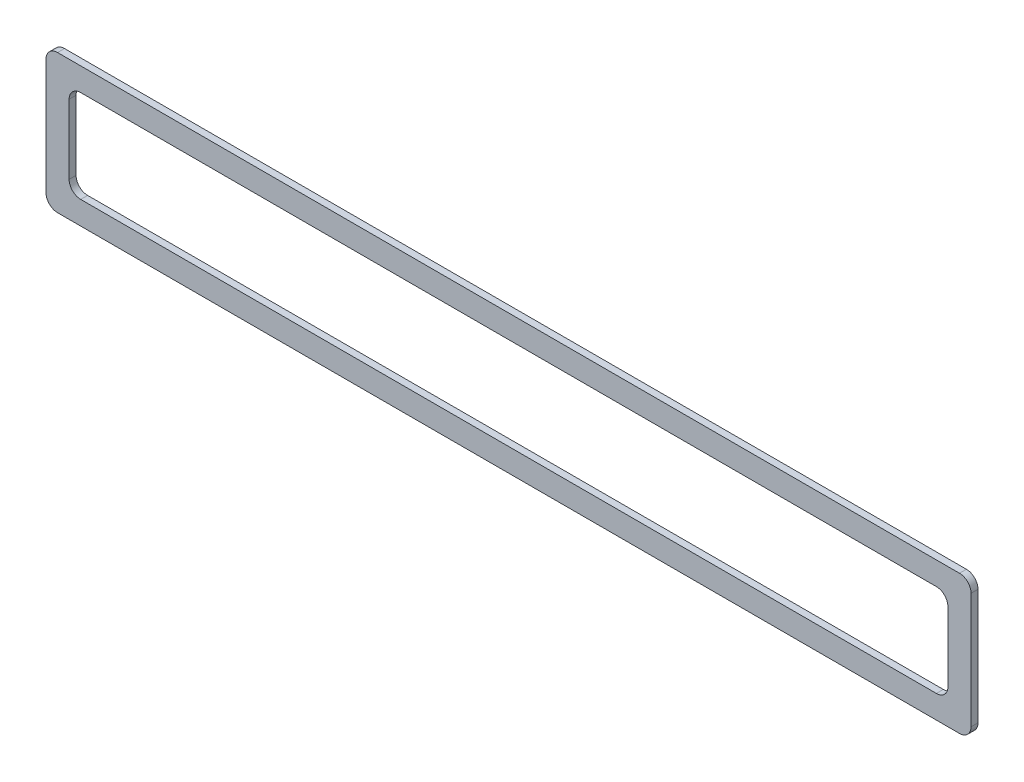
ISO-10303-21;
HEADER;
FILE_DESCRIPTION(('STEP AP214'),'2;1');
FILE_NAME('part.step','',(''),(''),'','','');
FILE_SCHEMA(('AUTOMOTIVE_DESIGN { 1 0 10303 214 1 1 1 1 }'));
ENDSEC;
DATA;
#1=APPLICATION_CONTEXT('core data for automotive mechanical design processes');
#2=APPLICATION_PROTOCOL_DEFINITION('international standard','automotive_design',2000,#1);
#3=PRODUCT_CONTEXT('',#1,'mechanical');
#4=PRODUCT('Part','Part','',(#3));
#5=PRODUCT_RELATED_PRODUCT_CATEGORY('part','',(#4));
#6=PRODUCT_DEFINITION_FORMATION('','',#4);
#7=PRODUCT_DEFINITION_CONTEXT('part definition',#1,'design');
#8=PRODUCT_DEFINITION('design','',#6,#7);
#9=PRODUCT_DEFINITION_SHAPE('','',#8);
#10=(LENGTH_UNIT() NAMED_UNIT(*) SI_UNIT(.MILLI.,.METRE.));
#11=(NAMED_UNIT(*) PLANE_ANGLE_UNIT() SI_UNIT($,.RADIAN.));
#12=(NAMED_UNIT(*) SI_UNIT($,.STERADIAN.) SOLID_ANGLE_UNIT());
#13=UNCERTAINTY_MEASURE_WITH_UNIT(LENGTH_MEASURE(1.E-05),#10,'distance_accuracy_value','');
#14=(GEOMETRIC_REPRESENTATION_CONTEXT(3) GLOBAL_UNCERTAINTY_ASSIGNED_CONTEXT((#13)) GLOBAL_UNIT_ASSIGNED_CONTEXT((#10,
#11,#12)) REPRESENTATION_CONTEXT('',''));
#15=CARTESIAN_POINT('',(0.,0.,0.));
#16=DIRECTION('',(0.,0.,1.));
#17=DIRECTION('',(1.,0.,0.));
#18=AXIS2_PLACEMENT_3D('',#15,#16,#17);
#19=CARTESIAN_POINT('',(195.,25.,3.));
#20=DIRECTION('',(0.,0.,-1.));
#21=DIRECTION('',(-1.,0.,0.));
#22=AXIS2_PLACEMENT_3D('',#19,#20,#21);
#23=PLANE('',#22);
#24=CARTESIAN_POINT('',(195.,25.,3.));
#25=DIRECTION('',(0.,0.,1.));
#26=DIRECTION('',(-1.,0.,0.));
#27=AXIS2_PLACEMENT_3D('',#24,#25,#26);
#28=CIRCLE('',#27,5.);
#29=CARTESIAN_POINT('',(200.,25.,3.));
#30=VERTEX_POINT('',#29);
#31=CARTESIAN_POINT('',(195.,30.,3.));
#32=VERTEX_POINT('',#31);
#33=EDGE_CURVE('E209',#30,#32,#28,.T.);
#34=ORIENTED_EDGE('',*,*,#33,.T.);
#35=DIRECTION('',(-1.,0.,0.));
#36=VECTOR('',#35,1.);
#37=CARTESIAN_POINT('',(-195.,30.,3.));
#38=LINE('',#37,#36);
#39=CARTESIAN_POINT('',(-195.,30.,3.));
#40=VERTEX_POINT('',#39);
#41=EDGE_CURVE('E212',#32,#40,#38,.T.);
#42=ORIENTED_EDGE('',*,*,#41,.T.);
#43=CARTESIAN_POINT('',(-195.,25.,3.));
#44=DIRECTION('',(0.,0.,1.));
#45=DIRECTION('',(-1.,0.,0.));
#46=AXIS2_PLACEMENT_3D('',#43,#44,#45);
#47=CIRCLE('',#46,5.);
#48=CARTESIAN_POINT('',(-200.,25.,3.));
#49=VERTEX_POINT('',#48);
#50=EDGE_CURVE('E215',#40,#49,#47,.T.);
#51=ORIENTED_EDGE('',*,*,#50,.T.);
#52=DIRECTION('',(0.,-1.,0.));
#53=VECTOR('',#52,1.);
#54=CARTESIAN_POINT('',(-200.,-25.,3.));
#55=LINE('',#54,#53);
#56=CARTESIAN_POINT('',(-200.,-25.,3.));
#57=VERTEX_POINT('',#56);
#58=EDGE_CURVE('E217',#49,#57,#55,.T.);
#59=ORIENTED_EDGE('',*,*,#58,.T.);
#60=CARTESIAN_POINT('',(-195.,-25.,3.));
#61=DIRECTION('',(0.,0.,1.));
#62=DIRECTION('',(-1.,0.,0.));
#63=AXIS2_PLACEMENT_3D('',#60,#61,#62);
#64=CIRCLE('',#63,5.);
#65=CARTESIAN_POINT('',(-195.,-30.,3.));
#66=VERTEX_POINT('',#65);
#67=EDGE_CURVE('E219',#57,#66,#64,.T.);
#68=ORIENTED_EDGE('',*,*,#67,.T.);
#69=DIRECTION('',(1.,0.,0.));
#70=VECTOR('',#69,1.);
#71=CARTESIAN_POINT('',(-195.,-30.,3.));
#72=LINE('',#71,#70);
#73=CARTESIAN_POINT('',(195.,-30.,3.));
#74=VERTEX_POINT('',#73);
#75=EDGE_CURVE('E221',#66,#74,#72,.T.);
#76=ORIENTED_EDGE('',*,*,#75,.T.);
#77=CARTESIAN_POINT('',(195.,-25.,3.));
#78=DIRECTION('',(0.,0.,1.));
#79=DIRECTION('',(1.,0.,0.));
#80=AXIS2_PLACEMENT_3D('',#77,#78,#79);
#81=CIRCLE('',#80,5.);
#82=CARTESIAN_POINT('',(200.,-25.,3.));
#83=VERTEX_POINT('',#82);
#84=EDGE_CURVE('E223',#74,#83,#81,.T.);
#85=ORIENTED_EDGE('',*,*,#84,.T.);
#86=DIRECTION('',(0.,1.,0.));
#87=VECTOR('',#86,1.);
#88=CARTESIAN_POINT('',(200.,-25.,3.));
#89=LINE('',#88,#87);
#90=EDGE_CURVE('E225',#83,#30,#89,.T.);
#91=ORIENTED_EDGE('',*,*,#90,.T.);
#92=EDGE_LOOP('',(#34,#42,#51,#59,#68,#76,#85,#91));
#93=FACE_BOUND('',#92,.T.);
#94=CARTESIAN_POINT('',(-185.,15.,3.));
#95=DIRECTION('',(0.,0.,1.));
#96=DIRECTION('',(-1.,0.,0.));
#97=AXIS2_PLACEMENT_3D('',#94,#95,#96);
#98=CIRCLE('',#97,5.);
#99=CARTESIAN_POINT('',(-185.,20.,3.));
#100=VERTEX_POINT('',#99);
#101=CARTESIAN_POINT('',(-190.,15.,3.));
#102=VERTEX_POINT('',#101);
#103=EDGE_CURVE('E144',#100,#102,#98,.T.);
#104=ORIENTED_EDGE('',*,*,#103,.F.);
#105=DIRECTION('',(-1.,0.,0.));
#106=VECTOR('',#105,1.);
#107=CARTESIAN_POINT('',(-185.,20.,3.));
#108=LINE('',#107,#106);
#109=CARTESIAN_POINT('',(185.,20.,3.));
#110=VERTEX_POINT('',#109);
#111=EDGE_CURVE('E177',#110,#100,#108,.T.);
#112=ORIENTED_EDGE('',*,*,#111,.F.);
#113=CARTESIAN_POINT('',(185.,15.,3.));
#114=DIRECTION('',(0.,0.,1.));
#115=DIRECTION('',(-1.,0.,0.));
#116=AXIS2_PLACEMENT_3D('',#113,#114,#115);
#117=CIRCLE('',#116,5.);
#118=CARTESIAN_POINT('',(190.,15.,3.));
#119=VERTEX_POINT('',#118);
#120=EDGE_CURVE('E175',#119,#110,#117,.T.);
#121=ORIENTED_EDGE('',*,*,#120,.F.);
#122=DIRECTION('',(0.,1.,0.));
#123=VECTOR('',#122,1.);
#124=CARTESIAN_POINT('',(190.,-15.,3.));
#125=LINE('',#124,#123);
#126=CARTESIAN_POINT('',(190.,-15.,3.));
#127=VERTEX_POINT('',#126);
#128=EDGE_CURVE('E173',#127,#119,#125,.T.);
#129=ORIENTED_EDGE('',*,*,#128,.F.);
#130=CARTESIAN_POINT('',(185.,-15.,3.));
#131=DIRECTION('',(0.,0.,1.));
#132=DIRECTION('',(1.,0.,0.));
#133=AXIS2_PLACEMENT_3D('',#130,#131,#132);
#134=CIRCLE('',#133,5.);
#135=CARTESIAN_POINT('',(185.,-20.,3.));
#136=VERTEX_POINT('',#135);
#137=EDGE_CURVE('E171',#136,#127,#134,.T.);
#138=ORIENTED_EDGE('',*,*,#137,.F.);
#139=DIRECTION('',(1.,0.,0.));
#140=VECTOR('',#139,1.);
#141=CARTESIAN_POINT('',(-185.,-20.,3.));
#142=LINE('',#141,#140);
#143=CARTESIAN_POINT('',(-185.,-20.,3.));
#144=VERTEX_POINT('',#143);
#145=EDGE_CURVE('E167',#144,#136,#142,.T.);
#146=ORIENTED_EDGE('',*,*,#145,.F.);
#147=CARTESIAN_POINT('',(-185.,-15.,3.));
#148=DIRECTION('',(0.,0.,1.));
#149=DIRECTION('',(-1.,0.,0.));
#150=AXIS2_PLACEMENT_3D('',#147,#148,#149);
#151=CIRCLE('',#150,5.);
#152=CARTESIAN_POINT('',(-190.,-15.,3.));
#153=VERTEX_POINT('',#152);
#154=EDGE_CURVE('E165',#153,#144,#151,.T.);
#155=ORIENTED_EDGE('',*,*,#154,.F.);
#156=DIRECTION('',(0.,-1.,0.));
#157=VECTOR('',#156,1.);
#158=CARTESIAN_POINT('',(-190.,-15.,3.));
#159=LINE('',#158,#157);
#160=EDGE_CURVE('E152',#102,#153,#159,.T.);
#161=ORIENTED_EDGE('',*,*,#160,.F.);
#162=EDGE_LOOP('',(#104,#112,#121,#129,#138,#146,#155,#161));
#163=FACE_BOUND('',#162,.T.);
#164=ADVANCED_FACE('F31',(#93,#163),#23,.F.);
#165=CARTESIAN_POINT('',(195.,25.,0.));
#166=DIRECTION('',(0.,0.,-1.));
#167=DIRECTION('',(-1.,0.,0.));
#168=AXIS2_PLACEMENT_3D('',#165,#166,#167);
#169=PLANE('',#168);
#170=CARTESIAN_POINT('',(195.,25.,0.));
#171=DIRECTION('',(0.,0.,1.));
#172=DIRECTION('',(-1.,0.,0.));
#173=AXIS2_PLACEMENT_3D('',#170,#171,#172);
#174=CIRCLE('',#173,5.);
#175=CARTESIAN_POINT('',(200.,25.,0.));
#176=VERTEX_POINT('',#175);
#177=CARTESIAN_POINT('',(195.,30.,0.));
#178=VERTEX_POINT('',#177);
#179=EDGE_CURVE('E160',#176,#178,#174,.T.);
#180=ORIENTED_EDGE('',*,*,#179,.F.);
#181=DIRECTION('',(0.,1.,0.));
#182=VECTOR('',#181,1.);
#183=CARTESIAN_POINT('',(200.,-25.,0.));
#184=LINE('',#183,#182);
#185=CARTESIAN_POINT('',(200.,-25.,0.));
#186=VERTEX_POINT('',#185);
#187=EDGE_CURVE('E213',#186,#176,#184,.T.);
#188=ORIENTED_EDGE('',*,*,#187,.F.);
#189=CARTESIAN_POINT('',(195.,-25.,0.));
#190=DIRECTION('',(0.,0.,1.));
#191=DIRECTION('',(1.,0.,0.));
#192=AXIS2_PLACEMENT_3D('',#189,#190,#191);
#193=CIRCLE('',#192,5.);
#194=CARTESIAN_POINT('',(195.,-30.,0.));
#195=VERTEX_POINT('',#194);
#196=EDGE_CURVE('E240',#195,#186,#193,.T.);
#197=ORIENTED_EDGE('',*,*,#196,.F.);
#198=DIRECTION('',(1.,0.,0.));
#199=VECTOR('',#198,1.);
#200=CARTESIAN_POINT('',(-195.,-30.,0.));
#201=LINE('',#200,#199);
#202=CARTESIAN_POINT('',(-195.,-30.,0.));
#203=VERTEX_POINT('',#202);
#204=EDGE_CURVE('E238',#203,#195,#201,.T.);
#205=ORIENTED_EDGE('',*,*,#204,.F.);
#206=CARTESIAN_POINT('',(-195.,-25.,0.));
#207=DIRECTION('',(0.,0.,1.));
#208=DIRECTION('',(-1.,0.,0.));
#209=AXIS2_PLACEMENT_3D('',#206,#207,#208);
#210=CIRCLE('',#209,5.);
#211=CARTESIAN_POINT('',(-200.,-25.,0.));
#212=VERTEX_POINT('',#211);
#213=EDGE_CURVE('E236',#212,#203,#210,.T.);
#214=ORIENTED_EDGE('',*,*,#213,.F.);
#215=DIRECTION('',(0.,-1.,0.));
#216=VECTOR('',#215,1.);
#217=CARTESIAN_POINT('',(-200.,-25.,0.));
#218=LINE('',#217,#216);
#219=CARTESIAN_POINT('',(-200.,25.,0.));
#220=VERTEX_POINT('',#219);
#221=EDGE_CURVE('E234',#220,#212,#218,.T.);
#222=ORIENTED_EDGE('',*,*,#221,.F.);
#223=CARTESIAN_POINT('',(-195.,25.,0.));
#224=DIRECTION('',(0.,0.,1.));
#225=DIRECTION('',(-1.,0.,0.));
#226=AXIS2_PLACEMENT_3D('',#223,#224,#225);
#227=CIRCLE('',#226,5.);
#228=CARTESIAN_POINT('',(-195.,30.,0.));
#229=VERTEX_POINT('',#228);
#230=EDGE_CURVE('E232',#229,#220,#227,.T.);
#231=ORIENTED_EDGE('',*,*,#230,.F.);
#232=DIRECTION('',(-1.,0.,0.));
#233=VECTOR('',#232,1.);
#234=CARTESIAN_POINT('',(-195.,30.,0.));
#235=LINE('',#234,#233);
#236=EDGE_CURVE('E230',#178,#229,#235,.T.);
#237=ORIENTED_EDGE('',*,*,#236,.F.);
#238=EDGE_LOOP('',(#180,#188,#197,#205,#214,#222,#231,#237));
#239=FACE_BOUND('',#238,.T.);
#240=DIRECTION('',(-1.,0.,0.));
#241=VECTOR('',#240,1.);
#242=CARTESIAN_POINT('',(-185.,20.,0.));
#243=LINE('',#242,#241);
#244=CARTESIAN_POINT('',(185.,20.,0.));
#245=VERTEX_POINT('',#244);
#246=CARTESIAN_POINT('',(-185.,20.,0.));
#247=VERTEX_POINT('',#246);
#248=EDGE_CURVE('E153',#245,#247,#243,.T.);
#249=ORIENTED_EDGE('',*,*,#248,.T.);
#250=CARTESIAN_POINT('',(-185.,15.,0.));
#251=DIRECTION('',(0.,0.,1.));
#252=DIRECTION('',(-1.,0.,0.));
#253=AXIS2_PLACEMENT_3D('',#250,#251,#252);
#254=CIRCLE('',#253,5.);
#255=CARTESIAN_POINT('',(-190.,15.,0.));
#256=VERTEX_POINT('',#255);
#257=EDGE_CURVE('E54',#247,#256,#254,.T.);
#258=ORIENTED_EDGE('',*,*,#257,.T.);
#259=DIRECTION('',(0.,-1.,0.));
#260=VECTOR('',#259,1.);
#261=CARTESIAN_POINT('',(-190.,-15.,0.));
#262=LINE('',#261,#260);
#263=CARTESIAN_POINT('',(-190.,-15.,0.));
#264=VERTEX_POINT('',#263);
#265=EDGE_CURVE('E159',#256,#264,#262,.T.);
#266=ORIENTED_EDGE('',*,*,#265,.T.);
#267=CARTESIAN_POINT('',(-185.,-15.,0.));
#268=DIRECTION('',(0.,0.,1.));
#269=DIRECTION('',(-1.,0.,0.));
#270=AXIS2_PLACEMENT_3D('',#267,#268,#269);
#271=CIRCLE('',#270,5.);
#272=CARTESIAN_POINT('',(-185.,-20.,0.));
#273=VERTEX_POINT('',#272);
#274=EDGE_CURVE('E181',#264,#273,#271,.T.);
#275=ORIENTED_EDGE('',*,*,#274,.T.);
#276=DIRECTION('',(1.,0.,0.));
#277=VECTOR('',#276,1.);
#278=CARTESIAN_POINT('',(-185.,-20.,0.));
#279=LINE('',#278,#277);
#280=CARTESIAN_POINT('',(185.,-20.,0.));
#281=VERTEX_POINT('',#280);
#282=EDGE_CURVE('E184',#273,#281,#279,.T.);
#283=ORIENTED_EDGE('',*,*,#282,.T.);
#284=CARTESIAN_POINT('',(185.,-15.,0.));
#285=DIRECTION('',(0.,0.,1.));
#286=DIRECTION('',(1.,0.,0.));
#287=AXIS2_PLACEMENT_3D('',#284,#285,#286);
#288=CIRCLE('',#287,5.);
#289=CARTESIAN_POINT('',(190.,-15.,0.));
#290=VERTEX_POINT('',#289);
#291=EDGE_CURVE('E187',#281,#290,#288,.T.);
#292=ORIENTED_EDGE('',*,*,#291,.T.);
#293=DIRECTION('',(0.,1.,0.));
#294=VECTOR('',#293,1.);
#295=CARTESIAN_POINT('',(190.,-15.,0.));
#296=LINE('',#295,#294);
#297=CARTESIAN_POINT('',(190.,15.,0.));
#298=VERTEX_POINT('',#297);
#299=EDGE_CURVE('E190',#290,#298,#296,.T.);
#300=ORIENTED_EDGE('',*,*,#299,.T.);
#301=CARTESIAN_POINT('',(185.,15.,0.));
#302=DIRECTION('',(0.,0.,1.));
#303=DIRECTION('',(-1.,0.,0.));
#304=AXIS2_PLACEMENT_3D('',#301,#302,#303);
#305=CIRCLE('',#304,5.);
#306=EDGE_CURVE('E193',#298,#245,#305,.T.);
#307=ORIENTED_EDGE('',*,*,#306,.T.);
#308=EDGE_LOOP('',(#249,#258,#266,#275,#283,#292,#300,#307));
#309=FACE_BOUND('',#308,.T.);
#310=ADVANCED_FACE('F270',(#239,#309),#169,.T.);
#311=CARTESIAN_POINT('',(195.,25.,3.));
#312=DIRECTION('',(0.,0.,-1.));
#313=DIRECTION('',(-1.,0.,0.));
#314=AXIS2_PLACEMENT_3D('',#311,#312,#313);
#315=CYLINDRICAL_SURFACE('',#314,5.);
#316=ORIENTED_EDGE('',*,*,#179,.T.);
#317=DIRECTION('',(0.,0.,-1.));
#318=VECTOR('',#317,1.);
#319=CARTESIAN_POINT('',(195.,30.,3.));
#320=LINE('',#319,#318);
#321=EDGE_CURVE('E11',#32,#178,#320,.T.);
#322=ORIENTED_EDGE('',*,*,#321,.F.);
#323=ORIENTED_EDGE('',*,*,#33,.F.);
#324=DIRECTION('',(0.,0.,-1.));
#325=VECTOR('',#324,1.);
#326=CARTESIAN_POINT('',(200.,25.,3.));
#327=LINE('',#326,#325);
#328=EDGE_CURVE('E227',#30,#176,#327,.T.);
#329=ORIENTED_EDGE('',*,*,#328,.T.);
#330=EDGE_LOOP('',(#316,#322,#323,#329));
#331=FACE_BOUND('',#330,.T.);
#332=ADVANCED_FACE('F33',(#331),#315,.T.);
#333=CARTESIAN_POINT('',(-195.,30.,3.));
#334=DIRECTION('',(0.,-1.,0.));
#335=DIRECTION('',(0.,0.,-1.));
#336=AXIS2_PLACEMENT_3D('',#333,#334,#335);
#337=PLANE('',#336);
#338=ORIENTED_EDGE('',*,*,#236,.T.);
#339=DIRECTION('',(0.,0.,-1.));
#340=VECTOR('',#339,1.);
#341=CARTESIAN_POINT('',(-195.,30.,3.));
#342=LINE('',#341,#340);
#343=EDGE_CURVE('E39',#40,#229,#342,.T.);
#344=ORIENTED_EDGE('',*,*,#343,.F.);
#345=ORIENTED_EDGE('',*,*,#41,.F.);
#346=ORIENTED_EDGE('',*,*,#321,.T.);
#347=EDGE_LOOP('',(#338,#344,#345,#346));
#348=FACE_BOUND('',#347,.T.);
#349=ADVANCED_FACE('F287',(#348),#337,.F.);
#350=CARTESIAN_POINT('',(-195.,25.,3.));
#351=DIRECTION('',(0.,0.,-1.));
#352=DIRECTION('',(-1.,0.,0.));
#353=AXIS2_PLACEMENT_3D('',#350,#351,#352);
#354=CYLINDRICAL_SURFACE('',#353,5.);
#355=ORIENTED_EDGE('',*,*,#230,.T.);
#356=DIRECTION('',(0.,0.,-1.));
#357=VECTOR('',#356,1.);
#358=CARTESIAN_POINT('',(-200.,25.,3.));
#359=LINE('',#358,#357);
#360=EDGE_CURVE('E257',#49,#220,#359,.T.);
#361=ORIENTED_EDGE('',*,*,#360,.F.);
#362=ORIENTED_EDGE('',*,*,#50,.F.);
#363=ORIENTED_EDGE('',*,*,#343,.T.);
#364=EDGE_LOOP('',(#355,#361,#362,#363));
#365=FACE_BOUND('',#364,.T.);
#366=ADVANCED_FACE('F264',(#365),#354,.T.);
#367=CARTESIAN_POINT('',(-200.,-25.,3.));
#368=DIRECTION('',(1.,0.,0.));
#369=DIRECTION('',(0.,0.,-1.));
#370=AXIS2_PLACEMENT_3D('',#367,#368,#369);
#371=PLANE('',#370);
#372=ORIENTED_EDGE('',*,*,#221,.T.);
#373=DIRECTION('',(0.,0.,-1.));
#374=VECTOR('',#373,1.);
#375=CARTESIAN_POINT('',(-200.,-25.,3.));
#376=LINE('',#375,#374);
#377=EDGE_CURVE('E254',#57,#212,#376,.T.);
#378=ORIENTED_EDGE('',*,*,#377,.F.);
#379=ORIENTED_EDGE('',*,*,#58,.F.);
#380=ORIENTED_EDGE('',*,*,#360,.T.);
#381=EDGE_LOOP('',(#372,#378,#379,#380));
#382=FACE_BOUND('',#381,.T.);
#383=ADVANCED_FACE('F276',(#382),#371,.F.);
#384=CARTESIAN_POINT('',(-195.,-25.,3.));
#385=DIRECTION('',(0.,0.,-1.));
#386=DIRECTION('',(-1.,0.,0.));
#387=AXIS2_PLACEMENT_3D('',#384,#385,#386);
#388=CYLINDRICAL_SURFACE('',#387,5.);
#389=ORIENTED_EDGE('',*,*,#213,.T.);
#390=DIRECTION('',(0.,0.,-1.));
#391=VECTOR('',#390,1.);
#392=CARTESIAN_POINT('',(-195.,-30.,3.));
#393=LINE('',#392,#391);
#394=EDGE_CURVE('E251',#66,#203,#393,.T.);
#395=ORIENTED_EDGE('',*,*,#394,.F.);
#396=ORIENTED_EDGE('',*,*,#67,.F.);
#397=ORIENTED_EDGE('',*,*,#377,.T.);
#398=EDGE_LOOP('',(#389,#395,#396,#397));
#399=FACE_BOUND('',#398,.T.);
#400=ADVANCED_FACE('F280',(#399),#388,.T.);
#401=CARTESIAN_POINT('',(-195.,-30.,3.));
#402=DIRECTION('',(0.,1.,0.));
#403=DIRECTION('',(0.,0.,1.));
#404=AXIS2_PLACEMENT_3D('',#401,#402,#403);
#405=PLANE('',#404);
#406=ORIENTED_EDGE('',*,*,#204,.T.);
#407=DIRECTION('',(0.,0.,-1.));
#408=VECTOR('',#407,1.);
#409=CARTESIAN_POINT('',(195.,-30.,3.));
#410=LINE('',#409,#408);
#411=EDGE_CURVE('E248',#74,#195,#410,.T.);
#412=ORIENTED_EDGE('',*,*,#411,.F.);
#413=ORIENTED_EDGE('',*,*,#75,.F.);
#414=ORIENTED_EDGE('',*,*,#394,.T.);
#415=EDGE_LOOP('',(#406,#412,#413,#414));
#416=FACE_BOUND('',#415,.T.);
#417=ADVANCED_FACE('F300',(#416),#405,.F.);
#418=CARTESIAN_POINT('',(195.,-25.,3.));
#419=DIRECTION('',(0.,0.,-1.));
#420=DIRECTION('',(-1.,0.,0.));
#421=AXIS2_PLACEMENT_3D('',#418,#419,#420);
#422=CYLINDRICAL_SURFACE('',#421,5.);
#423=ORIENTED_EDGE('',*,*,#196,.T.);
#424=DIRECTION('',(0.,0.,-1.));
#425=VECTOR('',#424,1.);
#426=CARTESIAN_POINT('',(200.,-25.,3.));
#427=LINE('',#426,#425);
#428=EDGE_CURVE('E245',#83,#186,#427,.T.);
#429=ORIENTED_EDGE('',*,*,#428,.F.);
#430=ORIENTED_EDGE('',*,*,#84,.F.);
#431=ORIENTED_EDGE('',*,*,#411,.T.);
#432=EDGE_LOOP('',(#423,#429,#430,#431));
#433=FACE_BOUND('',#432,.T.);
#434=ADVANCED_FACE('F298',(#433),#422,.T.);
#435=CARTESIAN_POINT('',(200.,-25.,3.));
#436=DIRECTION('',(-1.,0.,0.));
#437=DIRECTION('',(0.,0.,1.));
#438=AXIS2_PLACEMENT_3D('',#435,#436,#437);
#439=PLANE('',#438);
#440=ORIENTED_EDGE('',*,*,#187,.T.);
#441=ORIENTED_EDGE('',*,*,#328,.F.);
#442=ORIENTED_EDGE('',*,*,#90,.F.);
#443=ORIENTED_EDGE('',*,*,#428,.T.);
#444=EDGE_LOOP('',(#440,#441,#442,#443));
#445=FACE_BOUND('',#444,.T.);
#446=ADVANCED_FACE('F293',(#445),#439,.F.);
#447=CARTESIAN_POINT('',(-185.,15.,3.));
#448=DIRECTION('',(0.,0.,-1.));
#449=DIRECTION('',(-1.,0.,0.));
#450=AXIS2_PLACEMENT_3D('',#447,#448,#449);
#451=CYLINDRICAL_SURFACE('',#450,5.);
#452=ORIENTED_EDGE('',*,*,#257,.F.);
#453=DIRECTION('',(0.,0.,-1.));
#454=VECTOR('',#453,1.);
#455=CARTESIAN_POINT('',(-185.,20.,3.));
#456=LINE('',#455,#454);
#457=EDGE_CURVE('E148',#100,#247,#456,.T.);
#458=ORIENTED_EDGE('',*,*,#457,.F.);
#459=ORIENTED_EDGE('',*,*,#103,.T.);
#460=DIRECTION('',(0.,0.,-1.));
#461=VECTOR('',#460,1.);
#462=CARTESIAN_POINT('',(-190.,15.,3.));
#463=LINE('',#462,#461);
#464=EDGE_CURVE('E147',#102,#256,#463,.T.);
#465=ORIENTED_EDGE('',*,*,#464,.T.);
#466=EDGE_LOOP('',(#452,#458,#459,#465));
#467=FACE_BOUND('',#466,.T.);
#468=ADVANCED_FACE('F146',(#467),#451,.F.);
#469=CARTESIAN_POINT('',(-190.,-15.,3.));
#470=DIRECTION('',(1.,0.,0.));
#471=DIRECTION('',(0.,0.,-1.));
#472=AXIS2_PLACEMENT_3D('',#469,#470,#471);
#473=PLANE('',#472);
#474=ORIENTED_EDGE('',*,*,#265,.F.);
#475=ORIENTED_EDGE('',*,*,#464,.F.);
#476=ORIENTED_EDGE('',*,*,#160,.T.);
#477=DIRECTION('',(0.,0.,-1.));
#478=VECTOR('',#477,1.);
#479=CARTESIAN_POINT('',(-190.,-15.,3.));
#480=LINE('',#479,#478);
#481=EDGE_CURVE('E161',#153,#264,#480,.T.);
#482=ORIENTED_EDGE('',*,*,#481,.T.);
#483=EDGE_LOOP('',(#474,#475,#476,#482));
#484=FACE_BOUND('',#483,.T.);
#485=ADVANCED_FACE('F156',(#484),#473,.T.);
#486=CARTESIAN_POINT('',(-185.,-15.,3.));
#487=DIRECTION('',(0.,0.,-1.));
#488=DIRECTION('',(-1.,0.,0.));
#489=AXIS2_PLACEMENT_3D('',#486,#487,#488);
#490=CYLINDRICAL_SURFACE('',#489,5.);
#491=ORIENTED_EDGE('',*,*,#274,.F.);
#492=ORIENTED_EDGE('',*,*,#481,.F.);
#493=ORIENTED_EDGE('',*,*,#154,.T.);
#494=DIRECTION('',(0.,0.,-1.));
#495=VECTOR('',#494,1.);
#496=CARTESIAN_POINT('',(-185.,-20.,3.));
#497=LINE('',#496,#495);
#498=EDGE_CURVE('E206',#144,#273,#497,.T.);
#499=ORIENTED_EDGE('',*,*,#498,.T.);
#500=EDGE_LOOP('',(#491,#492,#493,#499));
#501=FACE_BOUND('',#500,.T.);
#502=ADVANCED_FACE('F325',(#501),#490,.F.);
#503=CARTESIAN_POINT('',(-185.,-20.,3.));
#504=DIRECTION('',(0.,1.,0.));
#505=DIRECTION('',(0.,0.,1.));
#506=AXIS2_PLACEMENT_3D('',#503,#504,#505);
#507=PLANE('',#506);
#508=ORIENTED_EDGE('',*,*,#282,.F.);
#509=ORIENTED_EDGE('',*,*,#498,.F.);
#510=ORIENTED_EDGE('',*,*,#145,.T.);
#511=DIRECTION('',(0.,0.,-1.));
#512=VECTOR('',#511,1.);
#513=CARTESIAN_POINT('',(185.,-20.,3.));
#514=LINE('',#513,#512);
#515=EDGE_CURVE('E204',#136,#281,#514,.T.);
#516=ORIENTED_EDGE('',*,*,#515,.T.);
#517=EDGE_LOOP('',(#508,#509,#510,#516));
#518=FACE_BOUND('',#517,.T.);
#519=ADVANCED_FACE('F329',(#518),#507,.T.);
#520=CARTESIAN_POINT('',(185.,-15.,3.));
#521=DIRECTION('',(0.,0.,-1.));
#522=DIRECTION('',(-1.,0.,0.));
#523=AXIS2_PLACEMENT_3D('',#520,#521,#522);
#524=CYLINDRICAL_SURFACE('',#523,5.);
#525=ORIENTED_EDGE('',*,*,#291,.F.);
#526=ORIENTED_EDGE('',*,*,#515,.F.);
#527=ORIENTED_EDGE('',*,*,#137,.T.);
#528=DIRECTION('',(0.,0.,-1.));
#529=VECTOR('',#528,1.);
#530=CARTESIAN_POINT('',(190.,-15.,3.));
#531=LINE('',#530,#529);
#532=EDGE_CURVE('E202',#127,#290,#531,.T.);
#533=ORIENTED_EDGE('',*,*,#532,.T.);
#534=EDGE_LOOP('',(#525,#526,#527,#533));
#535=FACE_BOUND('',#534,.T.);
#536=ADVANCED_FACE('F335',(#535),#524,.F.);
#537=CARTESIAN_POINT('',(190.,-15.,3.));
#538=DIRECTION('',(-1.,0.,0.));
#539=DIRECTION('',(0.,0.,1.));
#540=AXIS2_PLACEMENT_3D('',#537,#538,#539);
#541=PLANE('',#540);
#542=ORIENTED_EDGE('',*,*,#299,.F.);
#543=ORIENTED_EDGE('',*,*,#532,.F.);
#544=ORIENTED_EDGE('',*,*,#128,.T.);
#545=DIRECTION('',(0.,0.,-1.));
#546=VECTOR('',#545,1.);
#547=CARTESIAN_POINT('',(190.,15.,3.));
#548=LINE('',#547,#546);
#549=EDGE_CURVE('E200',#119,#298,#548,.T.);
#550=ORIENTED_EDGE('',*,*,#549,.T.);
#551=EDGE_LOOP('',(#542,#543,#544,#550));
#552=FACE_BOUND('',#551,.T.);
#553=ADVANCED_FACE('F339',(#552),#541,.T.);
#554=CARTESIAN_POINT('',(185.,15.,3.));
#555=DIRECTION('',(0.,0.,-1.));
#556=DIRECTION('',(-1.,0.,0.));
#557=AXIS2_PLACEMENT_3D('',#554,#555,#556);
#558=CYLINDRICAL_SURFACE('',#557,5.);
#559=ORIENTED_EDGE('',*,*,#306,.F.);
#560=ORIENTED_EDGE('',*,*,#549,.F.);
#561=ORIENTED_EDGE('',*,*,#120,.T.);
#562=DIRECTION('',(0.,0.,-1.));
#563=VECTOR('',#562,1.);
#564=CARTESIAN_POINT('',(185.,20.,3.));
#565=LINE('',#564,#563);
#566=EDGE_CURVE('E46',#110,#245,#565,.T.);
#567=ORIENTED_EDGE('',*,*,#566,.T.);
#568=EDGE_LOOP('',(#559,#560,#561,#567));
#569=FACE_BOUND('',#568,.T.);
#570=ADVANCED_FACE('F343',(#569),#558,.F.);
#571=CARTESIAN_POINT('',(-185.,20.,3.));
#572=DIRECTION('',(0.,-1.,0.));
#573=DIRECTION('',(0.,0.,-1.));
#574=AXIS2_PLACEMENT_3D('',#571,#572,#573);
#575=PLANE('',#574);
#576=ORIENTED_EDGE('',*,*,#248,.F.);
#577=ORIENTED_EDGE('',*,*,#566,.F.);
#578=ORIENTED_EDGE('',*,*,#111,.T.);
#579=ORIENTED_EDGE('',*,*,#457,.T.);
#580=EDGE_LOOP('',(#576,#577,#578,#579));
#581=FACE_BOUND('',#580,.T.);
#582=ADVANCED_FACE('F347',(#581),#575,.T.);
#583=CLOSED_SHELL('',(#164,#310,#332,#349,#366,#383,#400,#417,#434,#446,#468,#485,#502,#519,
#536,#553,#570,#582));
#584=MANIFOLD_SOLID_BREP('B2',#583);
#585=ADVANCED_BREP_SHAPE_REPRESENTATION('',(#18,#584),#14);
#586=SHAPE_DEFINITION_REPRESENTATION(#9,#585);
ENDSEC;
END-ISO-10303-21;
